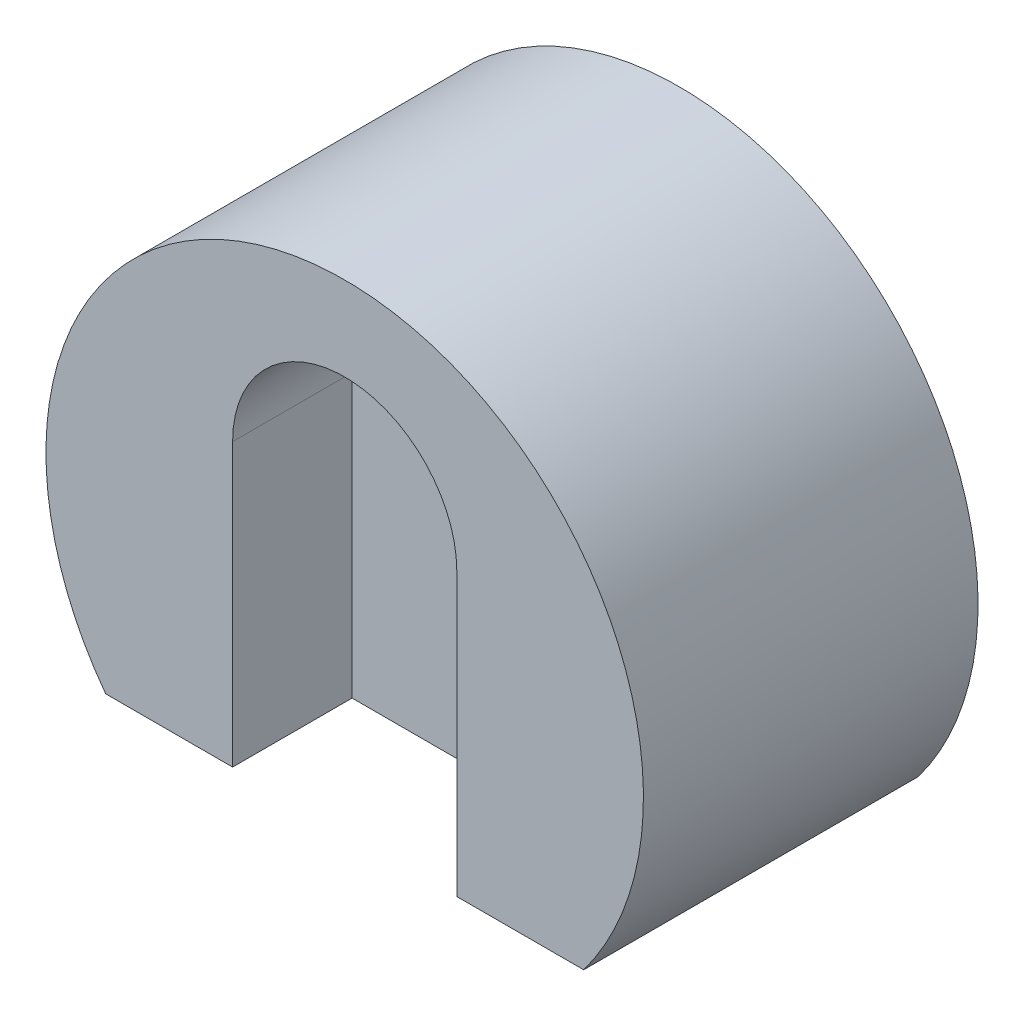
ISO-10303-21;
HEADER;
FILE_DESCRIPTION(('STEP AP214'),'2;1');
FILE_NAME('part.step','',(''),(''),'','','');
FILE_SCHEMA(('AUTOMOTIVE_DESIGN { 1 0 10303 214 1 1 1 1 }'));
ENDSEC;
DATA;
#1=APPLICATION_CONTEXT('core data for automotive mechanical design processes');
#2=APPLICATION_PROTOCOL_DEFINITION('international standard','automotive_design',2000,#1);
#3=PRODUCT_CONTEXT('',#1,'mechanical');
#4=PRODUCT('Part','Part','',(#3));
#5=PRODUCT_RELATED_PRODUCT_CATEGORY('part','',(#4));
#6=PRODUCT_DEFINITION_FORMATION('','',#4);
#7=PRODUCT_DEFINITION_CONTEXT('part definition',#1,'design');
#8=PRODUCT_DEFINITION('design','',#6,#7);
#9=PRODUCT_DEFINITION_SHAPE('','',#8);
#10=(LENGTH_UNIT() NAMED_UNIT(*) SI_UNIT(.MILLI.,.METRE.));
#11=(NAMED_UNIT(*) PLANE_ANGLE_UNIT() SI_UNIT($,.RADIAN.));
#12=(NAMED_UNIT(*) SI_UNIT($,.STERADIAN.) SOLID_ANGLE_UNIT());
#13=UNCERTAINTY_MEASURE_WITH_UNIT(LENGTH_MEASURE(1.E-05),#10,'distance_accuracy_value','');
#14=(GEOMETRIC_REPRESENTATION_CONTEXT(3) GLOBAL_UNCERTAINTY_ASSIGNED_CONTEXT((#13)) GLOBAL_UNIT_ASSIGNED_CONTEXT((#10,
#11,#12)) REPRESENTATION_CONTEXT('',''));
#15=CARTESIAN_POINT('',(0.,0.,0.));
#16=DIRECTION('',(0.,0.,1.));
#17=DIRECTION('',(1.,0.,0.));
#18=AXIS2_PLACEMENT_3D('',#15,#16,#17);
#19=CARTESIAN_POINT('',(0.,0.,-5.6));
#20=DIRECTION('',(0.,0.,1.));
#21=DIRECTION('',(1.,0.,0.));
#22=AXIS2_PLACEMENT_3D('',#19,#20,#21);
#23=CYLINDRICAL_SURFACE('',#22,5.);
#24=CARTESIAN_POINT('',(0.,0.,0.));
#25=DIRECTION('',(0.,0.,1.));
#26=DIRECTION('',(1.,0.,0.));
#27=AXIS2_PLACEMENT_3D('',#24,#25,#26);
#28=CIRCLE('',#27,5.);
#29=CARTESIAN_POINT('',(4.,-3.,0.));
#30=VERTEX_POINT('',#29);
#31=CARTESIAN_POINT('',(-4.,-3.,0.));
#32=VERTEX_POINT('',#31);
#33=EDGE_CURVE('E83',#30,#32,#28,.T.);
#34=ORIENTED_EDGE('',*,*,#33,.F.);
#35=DIRECTION('',(0.,0.,1.));
#36=VECTOR('',#35,1.);
#37=CARTESIAN_POINT('',(4.,-3.,-5.6));
#38=LINE('',#37,#36);
#39=CARTESIAN_POINT('',(4.,-3.,-5.6));
#40=VERTEX_POINT('',#39);
#41=EDGE_CURVE('E13',#40,#30,#38,.T.);
#42=ORIENTED_EDGE('',*,*,#41,.F.);
#43=CARTESIAN_POINT('',(0.,0.,-5.6));
#44=DIRECTION('',(0.,0.,1.));
#45=DIRECTION('',(1.,0.,0.));
#46=AXIS2_PLACEMENT_3D('',#43,#44,#45);
#47=CIRCLE('',#46,5.);
#48=CARTESIAN_POINT('',(-4.,-3.,-5.6));
#49=VERTEX_POINT('',#48);
#50=EDGE_CURVE('E102',#40,#49,#47,.T.);
#51=ORIENTED_EDGE('',*,*,#50,.T.);
#52=DIRECTION('',(0.,0.,1.));
#53=VECTOR('',#52,1.);
#54=CARTESIAN_POINT('',(-4.,-3.,-5.6));
#55=LINE('',#54,#53);
#56=EDGE_CURVE('E47',#49,#32,#55,.T.);
#57=ORIENTED_EDGE('',*,*,#56,.T.);
#58=EDGE_LOOP('',(#34,#42,#51,#57));
#59=FACE_BOUND('',#58,.T.);
#60=ADVANCED_FACE('F44',(#59),#23,.T.);
#61=CARTESIAN_POINT('',(-4.,-3.,-5.6));
#62=DIRECTION('',(0.,-1.,0.));
#63=DIRECTION('',(0.,0.,-1.));
#64=AXIS2_PLACEMENT_3D('',#61,#62,#63);
#65=PLANE('',#64);
#66=DIRECTION('',(0.,0.,1.));
#67=VECTOR('',#66,1.);
#68=CARTESIAN_POINT('',(1.87625476827979,-3.,-2.));
#69=LINE('',#68,#67);
#70=CARTESIAN_POINT('',(1.87625476827979,-3.,-2.));
#71=VERTEX_POINT('',#70);
#72=CARTESIAN_POINT('',(1.87625476827979,-3.,0.));
#73=VERTEX_POINT('',#72);
#74=EDGE_CURVE('E98',#71,#73,#69,.T.);
#75=ORIENTED_EDGE('',*,*,#74,.F.);
#76=DIRECTION('',(1.,0.,0.));
#77=VECTOR('',#76,1.);
#78=CARTESIAN_POINT('',(-1.87625476827979,-3.,-2.));
#79=LINE('',#78,#77);
#80=CARTESIAN_POINT('',(-1.87625476827979,-3.,-2.));
#81=VERTEX_POINT('',#80);
#82=EDGE_CURVE('E122',#81,#71,#79,.T.);
#83=ORIENTED_EDGE('',*,*,#82,.F.);
#84=DIRECTION('',(0.,0.,1.));
#85=VECTOR('',#84,1.);
#86=CARTESIAN_POINT('',(-1.87625476827979,-3.,-2.));
#87=LINE('',#86,#85);
#88=CARTESIAN_POINT('',(-1.87625476827979,-3.,0.));
#89=VERTEX_POINT('',#88);
#90=EDGE_CURVE('E108',#81,#89,#87,.T.);
#91=ORIENTED_EDGE('',*,*,#90,.T.);
#92=DIRECTION('',(1.,0.,0.));
#93=VECTOR('',#92,1.);
#94=CARTESIAN_POINT('',(-4.,-3.,0.));
#95=LINE('',#94,#93);
#96=EDGE_CURVE('E90',#32,#89,#95,.T.);
#97=ORIENTED_EDGE('',*,*,#96,.F.);
#98=ORIENTED_EDGE('',*,*,#56,.F.);
#99=DIRECTION('',(1.,0.,0.));
#100=VECTOR('',#99,1.);
#101=CARTESIAN_POINT('',(-4.,-3.,-5.6));
#102=LINE('',#101,#100);
#103=EDGE_CURVE('E95',#49,#40,#102,.T.);
#104=ORIENTED_EDGE('',*,*,#103,.T.);
#105=ORIENTED_EDGE('',*,*,#41,.T.);
#106=EDGE_CURVE('E80',#73,#30,#95,.T.);
#107=ORIENTED_EDGE('',*,*,#106,.F.);
#108=EDGE_LOOP('',(#75,#83,#91,#97,#98,#104,#105,#107));
#109=FACE_BOUND('',#108,.T.);
#110=ADVANCED_FACE('F93',(#109),#65,.T.);
#111=CARTESIAN_POINT('',(0.,0.,-5.6));
#112=DIRECTION('',(0.,0.,1.));
#113=DIRECTION('',(1.,0.,0.));
#114=AXIS2_PLACEMENT_3D('',#111,#112,#113);
#115=PLANE('',#114);
#116=ORIENTED_EDGE('',*,*,#50,.F.);
#117=ORIENTED_EDGE('',*,*,#103,.F.);
#118=EDGE_LOOP('',(#116,#117));
#119=FACE_BOUND('',#118,.T.);
#120=ADVANCED_FACE('F165',(#119),#115,.F.);
#121=CARTESIAN_POINT('',(0.,0.,0.));
#122=DIRECTION('',(0.,0.,1.));
#123=DIRECTION('',(1.,0.,0.));
#124=AXIS2_PLACEMENT_3D('',#121,#122,#123);
#125=PLANE('',#124);
#126=DIRECTION('',(0.,1.,0.));
#127=VECTOR('',#126,1.);
#128=CARTESIAN_POINT('',(1.87625476827979,-1.71766744886704,0.));
#129=LINE('',#128,#127);
#130=CARTESIAN_POINT('',(1.87625476827979,1.71766744886704,0.));
#131=VERTEX_POINT('',#130);
#132=EDGE_CURVE('E87',#73,#131,#129,.T.);
#133=ORIENTED_EDGE('',*,*,#132,.F.);
#134=ORIENTED_EDGE('',*,*,#106,.T.);
#135=ORIENTED_EDGE('',*,*,#33,.T.);
#136=ORIENTED_EDGE('',*,*,#96,.T.);
#137=DIRECTION('',(0.,-1.,0.));
#138=VECTOR('',#137,1.);
#139=CARTESIAN_POINT('',(-1.87625476827979,-1.71766744886704,0.));
#140=LINE('',#139,#138);
#141=CARTESIAN_POINT('',(-1.87625476827979,1.71766744886704,0.));
#142=VERTEX_POINT('',#141);
#143=EDGE_CURVE('E116',#142,#89,#140,.T.);
#144=ORIENTED_EDGE('',*,*,#143,.F.);
#145=CARTESIAN_POINT('',(0.,1.71766744886704,0.));
#146=DIRECTION('',(0.,0.,1.));
#147=DIRECTION('',(-1.,0.,0.));
#148=AXIS2_PLACEMENT_3D('',#145,#146,#147);
#149=CIRCLE('',#148,1.87625476827979);
#150=EDGE_CURVE('E58',#131,#142,#149,.T.);
#151=ORIENTED_EDGE('',*,*,#150,.F.);
#152=EDGE_LOOP('',(#133,#134,#135,#136,#144,#151));
#153=FACE_BOUND('',#152,.T.);
#154=ADVANCED_FACE('F81',(#153),#125,.T.);
#155=CARTESIAN_POINT('',(0.,1.71766744886704,-2.));
#156=DIRECTION('',(0.,0.,1.));
#157=DIRECTION('',(1.,0.,0.));
#158=AXIS2_PLACEMENT_3D('',#155,#156,#157);
#159=CYLINDRICAL_SURFACE('',#158,1.87625476827979);
#160=ORIENTED_EDGE('',*,*,#150,.T.);
#161=DIRECTION('',(0.,0.,1.));
#162=VECTOR('',#161,1.);
#163=CARTESIAN_POINT('',(-1.87625476827979,1.71766744886704,-2.));
#164=LINE('',#163,#162);
#165=CARTESIAN_POINT('',(-1.87625476827979,1.71766744886704,-2.));
#166=VERTEX_POINT('',#165);
#167=EDGE_CURVE('E106',#166,#142,#164,.T.);
#168=ORIENTED_EDGE('',*,*,#167,.F.);
#169=CARTESIAN_POINT('',(0.,1.71766744886704,-2.));
#170=DIRECTION('',(0.,0.,1.));
#171=DIRECTION('',(-1.,0.,0.));
#172=AXIS2_PLACEMENT_3D('',#169,#170,#171);
#173=CIRCLE('',#172,1.87625476827979);
#174=CARTESIAN_POINT('',(1.87625476827979,1.71766744886704,-2.));
#175=VERTEX_POINT('',#174);
#176=EDGE_CURVE('E115',#175,#166,#173,.T.);
#177=ORIENTED_EDGE('',*,*,#176,.F.);
#178=DIRECTION('',(0.,0.,1.));
#179=VECTOR('',#178,1.);
#180=CARTESIAN_POINT('',(1.87625476827979,1.71766744886704,-2.));
#181=LINE('',#180,#179);
#182=EDGE_CURVE('E96',#175,#131,#181,.T.);
#183=ORIENTED_EDGE('',*,*,#182,.T.);
#184=EDGE_LOOP('',(#160,#168,#177,#183));
#185=FACE_BOUND('',#184,.T.);
#186=ADVANCED_FACE('F140',(#185),#159,.F.);
#187=CARTESIAN_POINT('',(1.87625476827979,-1.71766744886704,-2.));
#188=DIRECTION('',(1.,0.,0.));
#189=DIRECTION('',(0.,0.,-1.));
#190=AXIS2_PLACEMENT_3D('',#187,#188,#189);
#191=PLANE('',#190);
#192=ORIENTED_EDGE('',*,*,#132,.T.);
#193=ORIENTED_EDGE('',*,*,#182,.F.);
#194=DIRECTION('',(0.,1.,0.));
#195=VECTOR('',#194,1.);
#196=CARTESIAN_POINT('',(1.87625476827979,-3.,-2.));
#197=LINE('',#196,#195);
#198=EDGE_CURVE('E109',#71,#175,#197,.T.);
#199=ORIENTED_EDGE('',*,*,#198,.F.);
#200=ORIENTED_EDGE('',*,*,#74,.T.);
#201=EDGE_LOOP('',(#192,#193,#199,#200));
#202=FACE_BOUND('',#201,.T.);
#203=ADVANCED_FACE('F148',(#202),#191,.F.);
#204=CARTESIAN_POINT('',(-1.87625476827979,-1.71766744886704,-2.));
#205=DIRECTION('',(-1.,0.,0.));
#206=DIRECTION('',(0.,0.,1.));
#207=AXIS2_PLACEMENT_3D('',#204,#205,#206);
#208=PLANE('',#207);
#209=ORIENTED_EDGE('',*,*,#143,.T.);
#210=ORIENTED_EDGE('',*,*,#90,.F.);
#211=DIRECTION('',(0.,-1.,0.));
#212=VECTOR('',#211,1.);
#213=CARTESIAN_POINT('',(-1.87625476827979,-1.71766744886704,-2.));
#214=LINE('',#213,#212);
#215=EDGE_CURVE('E125',#166,#81,#214,.T.);
#216=ORIENTED_EDGE('',*,*,#215,.F.);
#217=ORIENTED_EDGE('',*,*,#167,.T.);
#218=EDGE_LOOP('',(#209,#210,#216,#217));
#219=FACE_BOUND('',#218,.T.);
#220=ADVANCED_FACE('F151',(#219),#208,.F.);
#221=CARTESIAN_POINT('',(0.,1.71766744886704,-2.));
#222=DIRECTION('',(0.,0.,-1.));
#223=DIRECTION('',(-1.,0.,0.));
#224=AXIS2_PLACEMENT_3D('',#221,#222,#223);
#225=PLANE('',#224);
#226=ORIENTED_EDGE('',*,*,#176,.T.);
#227=ORIENTED_EDGE('',*,*,#215,.T.);
#228=ORIENTED_EDGE('',*,*,#82,.T.);
#229=ORIENTED_EDGE('',*,*,#198,.T.);
#230=EDGE_LOOP('',(#226,#227,#228,#229));
#231=FACE_BOUND('',#230,.T.);
#232=ADVANCED_FACE('F132',(#231),#225,.F.);
#233=CLOSED_SHELL('',(#60,#110,#120,#154,#186,#203,#220,#232));
#234=MANIFOLD_SOLID_BREP('B2',#233);
#235=ADVANCED_BREP_SHAPE_REPRESENTATION('',(#18,#234),#14);
#236=SHAPE_DEFINITION_REPRESENTATION(#9,#235);
ENDSEC;
END-ISO-10303-21;
